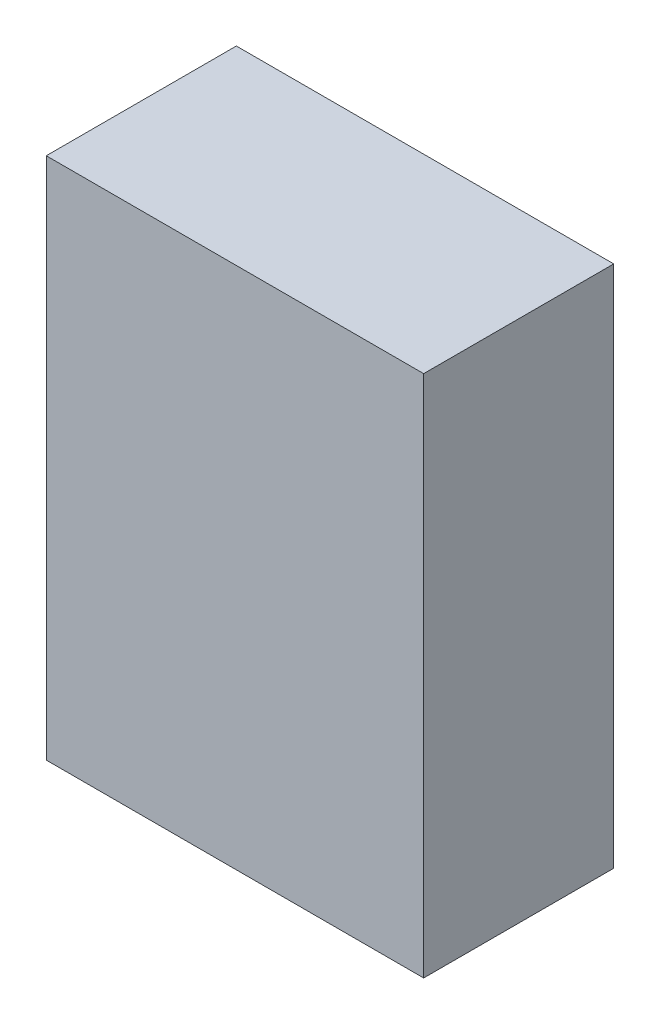
ISO-10303-21;
HEADER;
FILE_DESCRIPTION(('STEP AP214'),'2;1');
FILE_NAME('part.step','',(''),(''),'','','');
FILE_SCHEMA(('AUTOMOTIVE_DESIGN { 1 0 10303 214 1 1 1 1 }'));
ENDSEC;
DATA;
#1=APPLICATION_CONTEXT('core data for automotive mechanical design processes');
#2=APPLICATION_PROTOCOL_DEFINITION('international standard','automotive_design',2000,#1);
#3=PRODUCT_CONTEXT('',#1,'mechanical');
#4=PRODUCT('Part','Part','',(#3));
#5=PRODUCT_RELATED_PRODUCT_CATEGORY('part','',(#4));
#6=PRODUCT_DEFINITION_FORMATION('','',#4);
#7=PRODUCT_DEFINITION_CONTEXT('part definition',#1,'design');
#8=PRODUCT_DEFINITION('design','',#6,#7);
#9=PRODUCT_DEFINITION_SHAPE('','',#8);
#10=(LENGTH_UNIT() NAMED_UNIT(*) SI_UNIT(.MILLI.,.METRE.));
#11=(NAMED_UNIT(*) PLANE_ANGLE_UNIT() SI_UNIT($,.RADIAN.));
#12=(NAMED_UNIT(*) SI_UNIT($,.STERADIAN.) SOLID_ANGLE_UNIT());
#13=UNCERTAINTY_MEASURE_WITH_UNIT(LENGTH_MEASURE(1.E-05),#10,'distance_accuracy_value','');
#14=(GEOMETRIC_REPRESENTATION_CONTEXT(3) GLOBAL_UNCERTAINTY_ASSIGNED_CONTEXT((#13)) GLOBAL_UNIT_ASSIGNED_CONTEXT((#10,
#11,#12)) REPRESENTATION_CONTEXT('',''));
#15=CARTESIAN_POINT('',(0.,0.,0.));
#16=DIRECTION('',(0.,0.,1.));
#17=DIRECTION('',(1.,0.,0.));
#18=AXIS2_PLACEMENT_3D('',#15,#16,#17);
#19=CARTESIAN_POINT('',(0.,0.,8.625));
#20=DIRECTION('',(1.,0.,0.));
#21=DIRECTION('',(0.,0.,-1.));
#22=AXIS2_PLACEMENT_3D('',#19,#20,#21);
#23=PLANE('',#22);
#24=DIRECTION('',(0.,-1.,0.));
#25=VECTOR('',#24,1.);
#26=CARTESIAN_POINT('',(0.,0.,0.));
#27=LINE('',#26,#25);
#28=CARTESIAN_POINT('',(0.,23.75,0.));
#29=VERTEX_POINT('',#28);
#30=CARTESIAN_POINT('',(0.,0.,0.));
#31=VERTEX_POINT('',#30);
#32=EDGE_CURVE('E102',#29,#31,#27,.T.);
#33=ORIENTED_EDGE('',*,*,#32,.T.);
#34=DIRECTION('',(0.,0.,-1.));
#35=VECTOR('',#34,1.);
#36=CARTESIAN_POINT('',(0.,0.,8.625));
#37=LINE('',#36,#35);
#38=CARTESIAN_POINT('',(0.,0.,8.625));
#39=VERTEX_POINT('',#38);
#40=EDGE_CURVE('E11',#39,#31,#37,.T.);
#41=ORIENTED_EDGE('',*,*,#40,.F.);
#42=DIRECTION('',(0.,-1.,0.));
#43=VECTOR('',#42,1.);
#44=CARTESIAN_POINT('',(0.,0.,8.625));
#45=LINE('',#44,#43);
#46=CARTESIAN_POINT('',(0.,23.75,8.625));
#47=VERTEX_POINT('',#46);
#48=EDGE_CURVE('E95',#47,#39,#45,.T.);
#49=ORIENTED_EDGE('',*,*,#48,.F.);
#50=DIRECTION('',(0.,0.,-1.));
#51=VECTOR('',#50,1.);
#52=CARTESIAN_POINT('',(0.,23.75,8.625));
#53=LINE('',#52,#51);
#54=EDGE_CURVE('E99',#47,#29,#53,.T.);
#55=ORIENTED_EDGE('',*,*,#54,.T.);
#56=EDGE_LOOP('',(#33,#41,#49,#55));
#57=FACE_BOUND('',#56,.T.);
#58=ADVANCED_FACE('F41',(#57),#23,.F.);
#59=CARTESIAN_POINT('',(0.,0.,8.625));
#60=DIRECTION('',(0.,1.,0.));
#61=DIRECTION('',(0.,0.,1.));
#62=AXIS2_PLACEMENT_3D('',#59,#60,#61);
#63=PLANE('',#62);
#64=DIRECTION('',(1.,0.,0.));
#65=VECTOR('',#64,1.);
#66=CARTESIAN_POINT('',(0.,0.,0.));
#67=LINE('',#66,#65);
#68=CARTESIAN_POINT('',(17.125,0.,0.));
#69=VERTEX_POINT('',#68);
#70=EDGE_CURVE('E96',#31,#69,#67,.T.);
#71=ORIENTED_EDGE('',*,*,#70,.T.);
#72=DIRECTION('',(0.,0.,-1.));
#73=VECTOR('',#72,1.);
#74=CARTESIAN_POINT('',(17.125,0.,8.625));
#75=LINE('',#74,#73);
#76=CARTESIAN_POINT('',(17.125,0.,8.625));
#77=VERTEX_POINT('',#76);
#78=EDGE_CURVE('E47',#77,#69,#75,.T.);
#79=ORIENTED_EDGE('',*,*,#78,.F.);
#80=DIRECTION('',(1.,0.,0.));
#81=VECTOR('',#80,1.);
#82=CARTESIAN_POINT('',(0.,0.,8.625));
#83=LINE('',#82,#81);
#84=EDGE_CURVE('E87',#39,#77,#83,.T.);
#85=ORIENTED_EDGE('',*,*,#84,.F.);
#86=ORIENTED_EDGE('',*,*,#40,.T.);
#87=EDGE_LOOP('',(#71,#79,#85,#86));
#88=FACE_BOUND('',#87,.T.);
#89=ADVANCED_FACE('F92',(#88),#63,.F.);
#90=CARTESIAN_POINT('',(17.125,0.,8.625));
#91=DIRECTION('',(-1.,0.,0.));
#92=DIRECTION('',(0.,0.,1.));
#93=AXIS2_PLACEMENT_3D('',#90,#91,#92);
#94=PLANE('',#93);
#95=DIRECTION('',(0.,1.,0.));
#96=VECTOR('',#95,1.);
#97=CARTESIAN_POINT('',(17.125,0.,0.));
#98=LINE('',#97,#96);
#99=CARTESIAN_POINT('',(17.125,23.75,0.));
#100=VERTEX_POINT('',#99);
#101=EDGE_CURVE('E74',#69,#100,#98,.T.);
#102=ORIENTED_EDGE('',*,*,#101,.T.);
#103=DIRECTION('',(0.,0.,-1.));
#104=VECTOR('',#103,1.);
#105=CARTESIAN_POINT('',(17.125,23.75,8.625));
#106=LINE('',#105,#104);
#107=CARTESIAN_POINT('',(17.125,23.75,8.625));
#108=VERTEX_POINT('',#107);
#109=EDGE_CURVE('E100',#108,#100,#106,.T.);
#110=ORIENTED_EDGE('',*,*,#109,.F.);
#111=DIRECTION('',(0.,1.,0.));
#112=VECTOR('',#111,1.);
#113=CARTESIAN_POINT('',(17.125,0.,8.625));
#114=LINE('',#113,#112);
#115=EDGE_CURVE('E89',#77,#108,#114,.T.);
#116=ORIENTED_EDGE('',*,*,#115,.F.);
#117=ORIENTED_EDGE('',*,*,#78,.T.);
#118=EDGE_LOOP('',(#102,#110,#116,#117));
#119=FACE_BOUND('',#118,.T.);
#120=ADVANCED_FACE('F98',(#119),#94,.F.);
#121=CARTESIAN_POINT('',(0.,23.75,8.625));
#122=DIRECTION('',(0.,-1.,0.));
#123=DIRECTION('',(0.,0.,-1.));
#124=AXIS2_PLACEMENT_3D('',#121,#122,#123);
#125=PLANE('',#124);
#126=DIRECTION('',(-1.,0.,0.));
#127=VECTOR('',#126,1.);
#128=CARTESIAN_POINT('',(0.,23.75,0.));
#129=LINE('',#128,#127);
#130=EDGE_CURVE('E78',#100,#29,#129,.T.);
#131=ORIENTED_EDGE('',*,*,#130,.T.);
#132=ORIENTED_EDGE('',*,*,#54,.F.);
#133=DIRECTION('',(-1.,0.,0.));
#134=VECTOR('',#133,1.);
#135=CARTESIAN_POINT('',(0.,23.75,8.625));
#136=LINE('',#135,#134);
#137=EDGE_CURVE('E60',#108,#47,#136,.T.);
#138=ORIENTED_EDGE('',*,*,#137,.F.);
#139=ORIENTED_EDGE('',*,*,#109,.T.);
#140=EDGE_LOOP('',(#131,#132,#138,#139));
#141=FACE_BOUND('',#140,.T.);
#142=ADVANCED_FACE('F112',(#141),#125,.F.);
#143=CARTESIAN_POINT('',(0.,0.,8.625));
#144=DIRECTION('',(0.,0.,-1.));
#145=DIRECTION('',(-1.,0.,0.));
#146=AXIS2_PLACEMENT_3D('',#143,#144,#145);
#147=PLANE('',#146);
#148=ORIENTED_EDGE('',*,*,#48,.T.);
#149=ORIENTED_EDGE('',*,*,#84,.T.);
#150=ORIENTED_EDGE('',*,*,#115,.T.);
#151=ORIENTED_EDGE('',*,*,#137,.T.);
#152=EDGE_LOOP('',(#148,#149,#150,#151));
#153=FACE_BOUND('',#152,.T.);
#154=ADVANCED_FACE('F86',(#153),#147,.F.);
#155=CARTESIAN_POINT('',(0.,0.,0.));
#156=DIRECTION('',(0.,0.,-1.));
#157=DIRECTION('',(-1.,0.,0.));
#158=AXIS2_PLACEMENT_3D('',#155,#156,#157);
#159=PLANE('',#158);
#160=ORIENTED_EDGE('',*,*,#32,.F.);
#161=ORIENTED_EDGE('',*,*,#130,.F.);
#162=ORIENTED_EDGE('',*,*,#101,.F.);
#163=ORIENTED_EDGE('',*,*,#70,.F.);
#164=EDGE_LOOP('',(#160,#161,#162,#163));
#165=FACE_BOUND('',#164,.T.);
#166=ADVANCED_FACE('F111',(#165),#159,.T.);
#167=CLOSED_SHELL('',(#58,#89,#120,#142,#154,#166));
#168=MANIFOLD_SOLID_BREP('B2',#167);
#169=ADVANCED_BREP_SHAPE_REPRESENTATION('',(#18,#168),#14);
#170=SHAPE_DEFINITION_REPRESENTATION(#9,#169);
ENDSEC;
END-ISO-10303-21;
